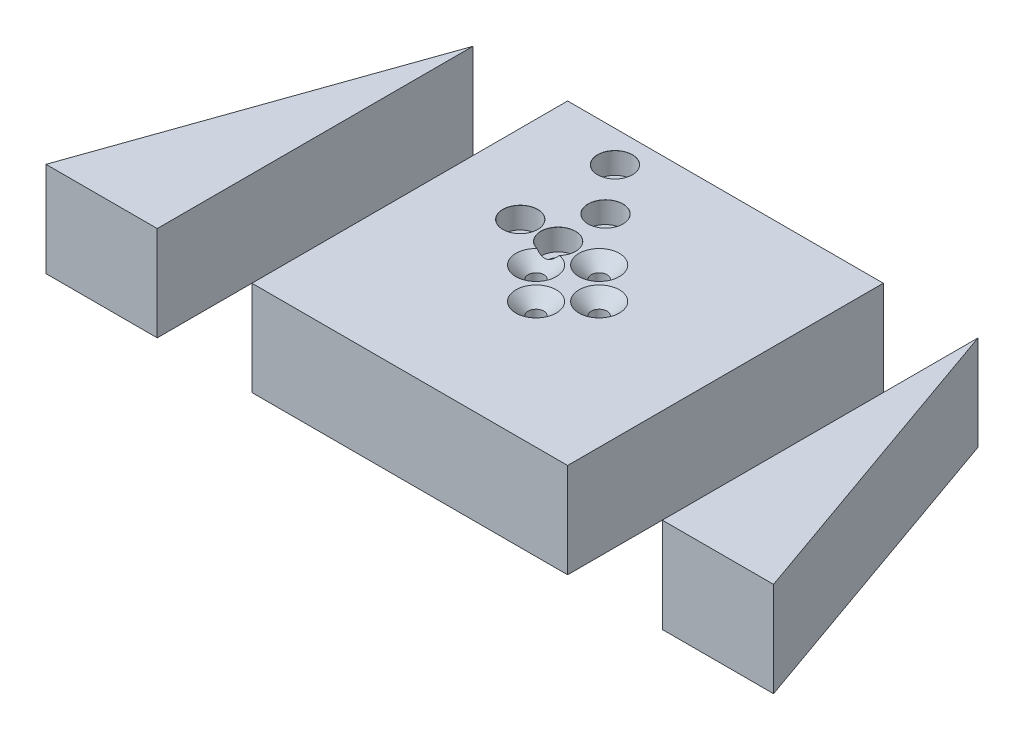
ISO-10303-21;
HEADER;
FILE_DESCRIPTION(('STEP AP214'),'2;1');
FILE_NAME('part.step','',(''),(''),'','','');
FILE_SCHEMA(('AUTOMOTIVE_DESIGN { 1 0 10303 214 1 1 1 1 }'));
ENDSEC;
DATA;
#1=APPLICATION_CONTEXT('core data for automotive mechanical design processes');
#2=APPLICATION_PROTOCOL_DEFINITION('international standard','automotive_design',2000,#1);
#3=PRODUCT_CONTEXT('',#1,'mechanical');
#4=PRODUCT('Part','Part','',(#3));
#5=PRODUCT_RELATED_PRODUCT_CATEGORY('part','',(#4));
#6=PRODUCT_DEFINITION_FORMATION('','',#4);
#7=PRODUCT_DEFINITION_CONTEXT('part definition',#1,'design');
#8=PRODUCT_DEFINITION('design','',#6,#7);
#9=PRODUCT_DEFINITION_SHAPE('','',#8);
#10=(LENGTH_UNIT() NAMED_UNIT(*) SI_UNIT(.MILLI.,.METRE.));
#11=(NAMED_UNIT(*) PLANE_ANGLE_UNIT() SI_UNIT($,.RADIAN.));
#12=(NAMED_UNIT(*) SI_UNIT($,.STERADIAN.) SOLID_ANGLE_UNIT());
#13=UNCERTAINTY_MEASURE_WITH_UNIT(LENGTH_MEASURE(1.E-05),#10,'distance_accuracy_value','');
#14=(GEOMETRIC_REPRESENTATION_CONTEXT(3) GLOBAL_UNCERTAINTY_ASSIGNED_CONTEXT((#13)) GLOBAL_UNIT_ASSIGNED_CONTEXT((#10,
#11,#12)) REPRESENTATION_CONTEXT('',''));
#15=CARTESIAN_POINT('',(0.,0.,0.));
#16=DIRECTION('',(0.,0.,1.));
#17=DIRECTION('',(1.,0.,0.));
#18=AXIS2_PLACEMENT_3D('',#15,#16,#17);
#19=CARTESIAN_POINT('',(-80.,30.,-50.));
#20=DIRECTION('',(-1.,0.,0.));
#21=DIRECTION('',(0.,0.,-1.));
#22=AXIS2_PLACEMENT_3D('',#19,#20,#21);
#23=PLANE('',#22);
#24=DIRECTION('',(0.,0.,1.));
#25=VECTOR('',#24,1.);
#26=CARTESIAN_POINT('',(-80.,0.,-50.));
#27=LINE('',#26,#25);
#28=CARTESIAN_POINT('',(-80.,0.,-50.));
#29=VERTEX_POINT('',#28);
#30=CARTESIAN_POINT('',(-80.,0.,50.));
#31=VERTEX_POINT('',#30);
#32=EDGE_CURVE('E12',#29,#31,#27,.T.);
#33=ORIENTED_EDGE('',*,*,#32,.F.);
#34=DIRECTION('',(0.,-1.,0.));
#35=VECTOR('',#34,1.);
#36=CARTESIAN_POINT('',(-80.,30.,-50.));
#37=LINE('',#36,#35);
#38=CARTESIAN_POINT('',(-80.,30.,-50.));
#39=VERTEX_POINT('',#38);
#40=EDGE_CURVE('E103',#39,#29,#37,.T.);
#41=ORIENTED_EDGE('',*,*,#40,.F.);
#42=DIRECTION('',(0.,0.,1.));
#43=VECTOR('',#42,1.);
#44=CARTESIAN_POINT('',(-80.,30.,-50.));
#45=LINE('',#44,#43);
#46=CARTESIAN_POINT('',(-80.,30.,50.));
#47=VERTEX_POINT('',#46);
#48=EDGE_CURVE('E65',#39,#47,#45,.T.);
#49=ORIENTED_EDGE('',*,*,#48,.T.);
#50=DIRECTION('',(0.,-1.,0.));
#51=VECTOR('',#50,1.);
#52=CARTESIAN_POINT('',(-80.,30.,50.));
#53=LINE('',#52,#51);
#54=EDGE_CURVE('E108',#47,#31,#53,.T.);
#55=ORIENTED_EDGE('',*,*,#54,.T.);
#56=EDGE_LOOP('',(#33,#41,#49,#55));
#57=FACE_BOUND('',#56,.T.);
#58=ADVANCED_FACE('F59',(#57),#23,.F.);
#59=CARTESIAN_POINT('',(-80.,30.,50.));
#60=DIRECTION('',(0.,0.,-1.));
#61=DIRECTION('',(1.,0.,0.));
#62=AXIS2_PLACEMENT_3D('',#59,#60,#61);
#63=PLANE('',#62);
#64=DIRECTION('',(-1.,0.,0.));
#65=VECTOR('',#64,1.);
#66=CARTESIAN_POINT('',(-80.,0.,50.));
#67=LINE('',#66,#65);
#68=CARTESIAN_POINT('',(-115.235457063712,0.,50.));
#69=VERTEX_POINT('',#68);
#70=EDGE_CURVE('E66',#31,#69,#67,.T.);
#71=ORIENTED_EDGE('',*,*,#70,.F.);
#72=ORIENTED_EDGE('',*,*,#54,.F.);
#73=DIRECTION('',(-1.,0.,0.));
#74=VECTOR('',#73,1.);
#75=CARTESIAN_POINT('',(-80.,30.,50.));
#76=LINE('',#75,#74);
#77=CARTESIAN_POINT('',(-115.235457063712,30.,50.));
#78=VERTEX_POINT('',#77);
#79=EDGE_CURVE('E91',#47,#78,#76,.T.);
#80=ORIENTED_EDGE('',*,*,#79,.T.);
#81=DIRECTION('',(0.,-1.,0.));
#82=VECTOR('',#81,1.);
#83=CARTESIAN_POINT('',(-115.235457063712,30.,50.));
#84=LINE('',#83,#82);
#85=EDGE_CURVE('E110',#78,#69,#84,.T.);
#86=ORIENTED_EDGE('',*,*,#85,.T.);
#87=EDGE_LOOP('',(#71,#72,#80,#86));
#88=FACE_BOUND('',#87,.T.);
#89=ADVANCED_FACE('F111',(#88),#63,.F.);
#90=CARTESIAN_POINT('',(-115.235457063712,30.,50.));
#91=DIRECTION('',(0.943163845465981,0.,0.33232809180962));
#92=DIRECTION('',(-0.33232809180962,0.,0.943163845465981));
#93=AXIS2_PLACEMENT_3D('',#90,#91,#92);
#94=PLANE('',#93);
#95=DIRECTION('',(0.33232809180962,0.,-0.943163845465981));
#96=VECTOR('',#95,1.);
#97=CARTESIAN_POINT('',(-115.235457063712,0.,50.));
#98=LINE('',#97,#96);
#99=EDGE_CURVE('E96',#69,#29,#98,.T.);
#100=ORIENTED_EDGE('',*,*,#99,.F.);
#101=ORIENTED_EDGE('',*,*,#85,.F.);
#102=DIRECTION('',(0.33232809180962,0.,-0.943163845465981));
#103=VECTOR('',#102,1.);
#104=CARTESIAN_POINT('',(-115.235457063712,30.,50.));
#105=LINE('',#104,#103);
#106=EDGE_CURVE('E89',#78,#39,#105,.T.);
#107=ORIENTED_EDGE('',*,*,#106,.T.);
#108=ORIENTED_EDGE('',*,*,#40,.T.);
#109=EDGE_LOOP('',(#100,#101,#107,#108));
#110=FACE_BOUND('',#109,.T.);
#111=ADVANCED_FACE('F102',(#110),#94,.F.);
#112=CARTESIAN_POINT('',(0.,30.,0.));
#113=DIRECTION('',(0.,1.,0.));
#114=DIRECTION('',(0.,0.,1.));
#115=AXIS2_PLACEMENT_3D('',#112,#113,#114);
#116=PLANE('',#115);
#117=ORIENTED_EDGE('',*,*,#48,.F.);
#118=ORIENTED_EDGE('',*,*,#106,.F.);
#119=ORIENTED_EDGE('',*,*,#79,.F.);
#120=EDGE_LOOP('',(#117,#118,#119));
#121=FACE_BOUND('',#120,.T.);
#122=ADVANCED_FACE('F58',(#121),#116,.T.);
#123=CARTESIAN_POINT('',(0.,0.,0.));
#124=DIRECTION('',(0.,1.,0.));
#125=DIRECTION('',(0.,0.,1.));
#126=AXIS2_PLACEMENT_3D('',#123,#124,#125);
#127=PLANE('',#126);
#128=ORIENTED_EDGE('',*,*,#32,.T.);
#129=ORIENTED_EDGE('',*,*,#70,.T.);
#130=ORIENTED_EDGE('',*,*,#99,.T.);
#131=EDGE_LOOP('',(#128,#129,#130));
#132=FACE_BOUND('',#131,.T.);
#133=ADVANCED_FACE('F98',(#132),#127,.F.);
#134=CLOSED_SHELL('',(#58,#89,#111,#122,#133));
#135=MANIFOLD_SOLID_BREP('B2',#134);
#136=CARTESIAN_POINT('',(80.,30.,-50.));
#137=DIRECTION('',(1.,0.,0.));
#138=DIRECTION('',(0.,0.,-1.));
#139=AXIS2_PLACEMENT_3D('',#136,#137,#138);
#140=PLANE('',#139);
#141=DIRECTION('',(0.,0.,1.));
#142=VECTOR('',#141,1.);
#143=CARTESIAN_POINT('',(80.,0.,-50.));
#144=LINE('',#143,#142);
#145=CARTESIAN_POINT('',(80.,0.,-50.));
#146=VERTEX_POINT('',#145);
#147=CARTESIAN_POINT('',(80.,0.,50.));
#148=VERTEX_POINT('',#147);
#149=EDGE_CURVE('E57',#146,#148,#144,.T.);
#150=ORIENTED_EDGE('',*,*,#149,.T.);
#151=DIRECTION('',(0.,-1.,0.));
#152=VECTOR('',#151,1.);
#153=CARTESIAN_POINT('',(80.,30.,50.));
#154=LINE('',#153,#152);
#155=CARTESIAN_POINT('',(80.,30.,50.));
#156=VERTEX_POINT('',#155);
#157=EDGE_CURVE('E254',#156,#148,#154,.T.);
#158=ORIENTED_EDGE('',*,*,#157,.F.);
#159=DIRECTION('',(0.,0.,1.));
#160=VECTOR('',#159,1.);
#161=CARTESIAN_POINT('',(80.,30.,-50.));
#162=LINE('',#161,#160);
#163=CARTESIAN_POINT('',(80.,30.,-50.));
#164=VERTEX_POINT('',#163);
#165=EDGE_CURVE('E166',#164,#156,#162,.T.);
#166=ORIENTED_EDGE('',*,*,#165,.F.);
#167=DIRECTION('',(0.,-1.,0.));
#168=VECTOR('',#167,1.);
#169=CARTESIAN_POINT('',(80.,30.,-50.));
#170=LINE('',#169,#168);
#171=EDGE_CURVE('E210',#164,#146,#170,.T.);
#172=ORIENTED_EDGE('',*,*,#171,.T.);
#173=EDGE_LOOP('',(#150,#158,#166,#172));
#174=FACE_BOUND('',#173,.T.);
#175=ADVANCED_FACE('F164',(#174),#140,.F.);
#176=CARTESIAN_POINT('',(80.,30.,50.));
#177=DIRECTION('',(0.,0.,-1.));
#178=DIRECTION('',(-1.,0.,0.));
#179=AXIS2_PLACEMENT_3D('',#176,#177,#178);
#180=PLANE('',#179);
#181=DIRECTION('',(1.,0.,0.));
#182=VECTOR('',#181,1.);
#183=CARTESIAN_POINT('',(80.,0.,50.));
#184=LINE('',#183,#182);
#185=CARTESIAN_POINT('',(115.235457063712,0.,50.));
#186=VERTEX_POINT('',#185);
#187=EDGE_CURVE('E172',#148,#186,#184,.T.);
#188=ORIENTED_EDGE('',*,*,#187,.T.);
#189=DIRECTION('',(0.,-1.,0.));
#190=VECTOR('',#189,1.);
#191=CARTESIAN_POINT('',(115.235457063712,30.,50.));
#192=LINE('',#191,#190);
#193=CARTESIAN_POINT('',(115.235457063712,30.,50.));
#194=VERTEX_POINT('',#193);
#195=EDGE_CURVE('E207',#194,#186,#192,.T.);
#196=ORIENTED_EDGE('',*,*,#195,.F.);
#197=DIRECTION('',(1.,0.,0.));
#198=VECTOR('',#197,1.);
#199=CARTESIAN_POINT('',(80.,30.,50.));
#200=LINE('',#199,#198);
#201=EDGE_CURVE('E198',#156,#194,#200,.T.);
#202=ORIENTED_EDGE('',*,*,#201,.F.);
#203=ORIENTED_EDGE('',*,*,#157,.T.);
#204=EDGE_LOOP('',(#188,#196,#202,#203));
#205=FACE_BOUND('',#204,.T.);
#206=ADVANCED_FACE('F225',(#205),#180,.F.);
#207=CARTESIAN_POINT('',(115.235457063712,30.,50.));
#208=DIRECTION('',(-0.943163845465981,0.,0.33232809180962));
#209=DIRECTION('',(0.33232809180962,0.,0.943163845465981));
#210=AXIS2_PLACEMENT_3D('',#207,#208,#209);
#211=PLANE('',#210);
#212=DIRECTION('',(-0.33232809180962,0.,-0.943163845465981));
#213=VECTOR('',#212,1.);
#214=CARTESIAN_POINT('',(115.235457063712,0.,50.));
#215=LINE('',#214,#213);
#216=EDGE_CURVE('E201',#186,#146,#215,.T.);
#217=ORIENTED_EDGE('',*,*,#216,.T.);
#218=ORIENTED_EDGE('',*,*,#171,.F.);
#219=DIRECTION('',(-0.33232809180962,0.,-0.943163845465981));
#220=VECTOR('',#219,1.);
#221=CARTESIAN_POINT('',(115.235457063712,30.,50.));
#222=LINE('',#221,#220);
#223=EDGE_CURVE('E213',#194,#164,#222,.T.);
#224=ORIENTED_EDGE('',*,*,#223,.F.);
#225=ORIENTED_EDGE('',*,*,#195,.T.);
#226=EDGE_LOOP('',(#217,#218,#224,#225));
#227=FACE_BOUND('',#226,.T.);
#228=ADVANCED_FACE('F202',(#227),#211,.F.);
#229=CARTESIAN_POINT('',(0.,30.,0.));
#230=DIRECTION('',(0.,1.,0.));
#231=DIRECTION('',(0.,0.,1.));
#232=AXIS2_PLACEMENT_3D('',#229,#230,#231);
#233=PLANE('',#232);
#234=ORIENTED_EDGE('',*,*,#165,.T.);
#235=ORIENTED_EDGE('',*,*,#201,.T.);
#236=ORIENTED_EDGE('',*,*,#223,.T.);
#237=EDGE_LOOP('',(#234,#235,#236));
#238=FACE_BOUND('',#237,.T.);
#239=ADVANCED_FACE('F170',(#238),#233,.T.);
#240=CARTESIAN_POINT('',(0.,0.,0.));
#241=DIRECTION('',(0.,1.,0.));
#242=DIRECTION('',(0.,0.,1.));
#243=AXIS2_PLACEMENT_3D('',#240,#241,#242);
#244=PLANE('',#243);
#245=ORIENTED_EDGE('',*,*,#149,.F.);
#246=ORIENTED_EDGE('',*,*,#216,.F.);
#247=ORIENTED_EDGE('',*,*,#187,.F.);
#248=EDGE_LOOP('',(#245,#246,#247));
#249=FACE_BOUND('',#248,.T.);
#250=ADVANCED_FACE('F214',(#249),#244,.F.);
#251=CLOSED_SHELL('',(#175,#206,#228,#239,#250));
#252=MANIFOLD_SOLID_BREP('B6',#251);
#253=CARTESIAN_POINT('',(50.,30.,-50.));
#254=DIRECTION('',(-1.,0.,0.));
#255=DIRECTION('',(0.,0.,1.));
#256=AXIS2_PLACEMENT_3D('',#253,#254,#255);
#257=PLANE('',#256);
#258=DIRECTION('',(0.,0.,-1.));
#259=VECTOR('',#258,1.);
#260=CARTESIAN_POINT('',(50.,0.,-50.));
#261=LINE('',#260,#259);
#262=CARTESIAN_POINT('',(50.,0.,50.));
#263=VERTEX_POINT('',#262);
#264=CARTESIAN_POINT('',(50.,0.,-50.));
#265=VERTEX_POINT('',#264);
#266=EDGE_CURVE('E425',#263,#265,#261,.T.);
#267=ORIENTED_EDGE('',*,*,#266,.T.);
#268=DIRECTION('',(0.,-1.,0.));
#269=VECTOR('',#268,1.);
#270=CARTESIAN_POINT('',(50.,30.,-50.));
#271=LINE('',#270,#269);
#272=CARTESIAN_POINT('',(50.,30.,-50.));
#273=VERTEX_POINT('',#272);
#274=EDGE_CURVE('E452',#273,#265,#271,.T.);
#275=ORIENTED_EDGE('',*,*,#274,.F.);
#276=DIRECTION('',(0.,0.,-1.));
#277=VECTOR('',#276,1.);
#278=CARTESIAN_POINT('',(50.,30.,-50.));
#279=LINE('',#278,#277);
#280=CARTESIAN_POINT('',(50.,30.,50.));
#281=VERTEX_POINT('',#280);
#282=EDGE_CURVE('E421',#281,#273,#279,.T.);
#283=ORIENTED_EDGE('',*,*,#282,.F.);
#284=DIRECTION('',(0.,-1.,0.));
#285=VECTOR('',#284,1.);
#286=CARTESIAN_POINT('',(50.,30.,50.));
#287=LINE('',#286,#285);
#288=EDGE_CURVE('E433',#281,#263,#287,.T.);
#289=ORIENTED_EDGE('',*,*,#288,.T.);
#290=EDGE_LOOP('',(#267,#275,#283,#289));
#291=FACE_BOUND('',#290,.T.);
#292=ADVANCED_FACE('F263',(#291),#257,.F.);
#293=CARTESIAN_POINT('',(-50.,30.,-50.));
#294=DIRECTION('',(0.,0.,1.));
#295=DIRECTION('',(1.,0.,0.));
#296=AXIS2_PLACEMENT_3D('',#293,#294,#295);
#297=PLANE('',#296);
#298=DIRECTION('',(-1.,0.,0.));
#299=VECTOR('',#298,1.);
#300=CARTESIAN_POINT('',(-50.,0.,-50.));
#301=LINE('',#300,#299);
#302=CARTESIAN_POINT('',(-50.,0.,-50.));
#303=VERTEX_POINT('',#302);
#304=EDGE_CURVE('E440',#265,#303,#301,.T.);
#305=ORIENTED_EDGE('',*,*,#304,.T.);
#306=DIRECTION('',(0.,-1.,0.));
#307=VECTOR('',#306,1.);
#308=CARTESIAN_POINT('',(-50.,30.,-50.));
#309=LINE('',#308,#307);
#310=CARTESIAN_POINT('',(-50.,30.,-50.));
#311=VERTEX_POINT('',#310);
#312=EDGE_CURVE('E447',#311,#303,#309,.T.);
#313=ORIENTED_EDGE('',*,*,#312,.F.);
#314=DIRECTION('',(-1.,0.,0.));
#315=VECTOR('',#314,1.);
#316=CARTESIAN_POINT('',(-50.,30.,-50.));
#317=LINE('',#316,#315);
#318=EDGE_CURVE('E325',#273,#311,#317,.T.);
#319=ORIENTED_EDGE('',*,*,#318,.F.);
#320=ORIENTED_EDGE('',*,*,#274,.T.);
#321=EDGE_LOOP('',(#305,#313,#319,#320));
#322=FACE_BOUND('',#321,.T.);
#323=ADVANCED_FACE('F554',(#322),#297,.F.);
#324=CARTESIAN_POINT('',(-50.,30.,-50.));
#325=DIRECTION('',(1.,0.,0.));
#326=DIRECTION('',(0.,0.,-1.));
#327=AXIS2_PLACEMENT_3D('',#324,#325,#326);
#328=PLANE('',#327);
#329=DIRECTION('',(0.,0.,1.));
#330=VECTOR('',#329,1.);
#331=CARTESIAN_POINT('',(-50.,0.,-50.));
#332=LINE('',#331,#330);
#333=CARTESIAN_POINT('',(-50.,0.,50.));
#334=VERTEX_POINT('',#333);
#335=EDGE_CURVE('E439',#303,#334,#332,.T.);
#336=ORIENTED_EDGE('',*,*,#335,.T.);
#337=DIRECTION('',(0.,-1.,0.));
#338=VECTOR('',#337,1.);
#339=CARTESIAN_POINT('',(-50.,30.,50.));
#340=LINE('',#339,#338);
#341=CARTESIAN_POINT('',(-50.,30.,50.));
#342=VERTEX_POINT('',#341);
#343=EDGE_CURVE('E450',#342,#334,#340,.T.);
#344=ORIENTED_EDGE('',*,*,#343,.F.);
#345=DIRECTION('',(0.,0.,1.));
#346=VECTOR('',#345,1.);
#347=CARTESIAN_POINT('',(-50.,30.,-50.));
#348=LINE('',#347,#346);
#349=EDGE_CURVE('E428',#311,#342,#348,.T.);
#350=ORIENTED_EDGE('',*,*,#349,.F.);
#351=ORIENTED_EDGE('',*,*,#312,.T.);
#352=EDGE_LOOP('',(#336,#344,#350,#351));
#353=FACE_BOUND('',#352,.T.);
#354=ADVANCED_FACE('F552',(#353),#328,.F.);
#355=CARTESIAN_POINT('',(-50.,30.,50.));
#356=DIRECTION('',(0.,0.,-1.));
#357=DIRECTION('',(-1.,0.,0.));
#358=AXIS2_PLACEMENT_3D('',#355,#356,#357);
#359=PLANE('',#358);
#360=DIRECTION('',(1.,0.,0.));
#361=VECTOR('',#360,1.);
#362=CARTESIAN_POINT('',(-50.,0.,50.));
#363=LINE('',#362,#361);
#364=EDGE_CURVE('E314',#334,#263,#363,.T.);
#365=ORIENTED_EDGE('',*,*,#364,.T.);
#366=ORIENTED_EDGE('',*,*,#288,.F.);
#367=DIRECTION('',(1.,0.,0.));
#368=VECTOR('',#367,1.);
#369=CARTESIAN_POINT('',(-50.,30.,50.));
#370=LINE('',#369,#368);
#371=EDGE_CURVE('E291',#342,#281,#370,.T.);
#372=ORIENTED_EDGE('',*,*,#371,.F.);
#373=ORIENTED_EDGE('',*,*,#343,.T.);
#374=EDGE_LOOP('',(#365,#366,#372,#373));
#375=FACE_BOUND('',#374,.T.);
#376=ADVANCED_FACE('F542',(#375),#359,.F.);
#377=CARTESIAN_POINT('',(0.,30.,0.));
#378=DIRECTION('',(0.,1.,0.));
#379=DIRECTION('',(0.,0.,1.));
#380=AXIS2_PLACEMENT_3D('',#377,#378,#379);
#381=PLANE('',#380);
#382=CARTESIAN_POINT('',(10.,30.,-1.04744440165294E-13));
#383=DIRECTION('',(0.,1.,0.));
#384=DIRECTION('',(0.,0.,1.));
#385=AXIS2_PLACEMENT_3D('',#382,#383,#384);
#386=CIRCLE('',#385,6.4);
#387=CARTESIAN_POINT('',(10.,30.,6.39999999999989));
#388=VERTEX_POINT('',#387);
#389=EDGE_CURVE('E782',#388,#388,#386,.T.);
#390=ORIENTED_EDGE('',*,*,#389,.F.);
#391=EDGE_LOOP('',(#390));
#392=FACE_BOUND('',#391,.T.);
#393=CARTESIAN_POINT('',(0.,30.,10.));
#394=DIRECTION('',(0.,1.,0.));
#395=DIRECTION('',(0.,0.,1.));
#396=AXIS2_PLACEMENT_3D('',#393,#394,#395);
#397=CIRCLE('',#396,6.4);
#398=CARTESIAN_POINT('',(0.,30.,16.4));
#399=VERTEX_POINT('',#398);
#400=EDGE_CURVE('E794',#399,#399,#397,.T.);
#401=ORIENTED_EDGE('',*,*,#400,.F.);
#402=EDGE_LOOP('',(#401));
#403=FACE_BOUND('',#402,.T.);
#404=CARTESIAN_POINT('',(-10.,30.,0.));
#405=DIRECTION('',(0.,1.,0.));
#406=DIRECTION('',(0.,0.,1.));
#407=AXIS2_PLACEMENT_3D('',#404,#405,#406);
#408=CIRCLE('',#407,6.4);
#409=CARTESIAN_POINT('',(-14.39358756039,30.,-4.65364248188297));
#410=VERTEX_POINT('',#409);
#411=CARTESIAN_POINT('',(-8.89359707263768,30.,-6.30363962820855));
#412=VERTEX_POINT('',#411);
#413=EDGE_CURVE('E284',#410,#412,#408,.T.);
#414=ORIENTED_EDGE('',*,*,#413,.F.);
#415=CARTESIAN_POINT('',(-13.,30.,-10.));
#416=DIRECTION('',(0.,1.,0.));
#417=DIRECTION('',(0.,0.,1.));
#418=AXIS2_PLACEMENT_3D('',#415,#416,#417);
#419=CIRCLE('',#418,5.525);
#420=EDGE_CURVE('E337',#412,#410,#419,.T.);
#421=ORIENTED_EDGE('',*,*,#420,.F.);
#422=EDGE_LOOP('',(#414,#421));
#423=FACE_BOUND('',#422,.T.);
#424=CARTESIAN_POINT('',(-13.,30.,-25.));
#425=DIRECTION('',(0.,1.,0.));
#426=DIRECTION('',(0.,0.,1.));
#427=AXIS2_PLACEMENT_3D('',#424,#425,#426);
#428=CIRCLE('',#427,5.525);
#429=CARTESIAN_POINT('',(-13.,30.,-19.475));
#430=VERTEX_POINT('',#429);
#431=EDGE_CURVE('E482',#430,#430,#428,.T.);
#432=ORIENTED_EDGE('',*,*,#431,.F.);
#433=EDGE_LOOP('',(#432));
#434=FACE_BOUND('',#433,.T.);
#435=CARTESIAN_POINT('',(-25.,30.,-40.));
#436=DIRECTION('',(0.,1.,0.));
#437=DIRECTION('',(0.,0.,1.));
#438=AXIS2_PLACEMENT_3D('',#435,#436,#437);
#439=CIRCLE('',#438,5.525);
#440=CARTESIAN_POINT('',(-25.,30.,-34.475));
#441=VERTEX_POINT('',#440);
#442=EDGE_CURVE('E367',#441,#441,#439,.T.);
#443=ORIENTED_EDGE('',*,*,#442,.F.);
#444=EDGE_LOOP('',(#443));
#445=FACE_BOUND('',#444,.T.);
#446=CARTESIAN_POINT('',(0.,30.,-10.));
#447=DIRECTION('',(0.,1.,0.));
#448=DIRECTION('',(0.,0.,1.));
#449=AXIS2_PLACEMENT_3D('',#446,#447,#448);
#450=CIRCLE('',#449,6.4);
#451=CARTESIAN_POINT('',(0.,30.,-3.6));
#452=VERTEX_POINT('',#451);
#453=EDGE_CURVE('E388',#452,#452,#450,.T.);
#454=ORIENTED_EDGE('',*,*,#453,.F.);
#455=EDGE_LOOP('',(#454));
#456=FACE_BOUND('',#455,.T.);
#457=CARTESIAN_POINT('',(-25.,30.,-10.));
#458=DIRECTION('',(0.,1.,0.));
#459=DIRECTION('',(0.,0.,1.));
#460=AXIS2_PLACEMENT_3D('',#457,#458,#459);
#461=CIRCLE('',#460,5.525);
#462=CARTESIAN_POINT('',(-25.,30.,-4.475));
#463=VERTEX_POINT('',#462);
#464=EDGE_CURVE('E405',#463,#463,#461,.T.);
#465=ORIENTED_EDGE('',*,*,#464,.F.);
#466=EDGE_LOOP('',(#465));
#467=FACE_BOUND('',#466,.T.);
#468=ORIENTED_EDGE('',*,*,#282,.T.);
#469=ORIENTED_EDGE('',*,*,#318,.T.);
#470=ORIENTED_EDGE('',*,*,#349,.T.);
#471=ORIENTED_EDGE('',*,*,#371,.T.);
#472=EDGE_LOOP('',(#468,#469,#470,#471));
#473=FACE_BOUND('',#472,.T.);
#474=ADVANCED_FACE('F336',(#392,#403,#423,#434,#445,#456,#467,#473),#381,.T.);
#475=CARTESIAN_POINT('',(0.,0.,0.));
#476=DIRECTION('',(0.,1.,0.));
#477=DIRECTION('',(0.,0.,1.));
#478=AXIS2_PLACEMENT_3D('',#475,#476,#477);
#479=PLANE('',#478);
#480=CARTESIAN_POINT('',(10.,0.,-1.04744440165294E-13));
#481=DIRECTION('',(0.,1.,0.));
#482=DIRECTION('',(0.,0.,1.));
#483=AXIS2_PLACEMENT_3D('',#480,#481,#482);
#484=CIRCLE('',#483,2.5);
#485=CARTESIAN_POINT('',(10.,0.,2.4999999999999));
#486=VERTEX_POINT('',#485);
#487=EDGE_CURVE('E786',#486,#486,#484,.T.);
#488=ORIENTED_EDGE('',*,*,#487,.T.);
#489=EDGE_LOOP('',(#488));
#490=FACE_BOUND('',#489,.T.);
#491=CARTESIAN_POINT('',(0.,0.,10.));
#492=DIRECTION('',(0.,1.,0.));
#493=DIRECTION('',(0.,0.,1.));
#494=AXIS2_PLACEMENT_3D('',#491,#492,#493);
#495=CIRCLE('',#494,2.5);
#496=CARTESIAN_POINT('',(0.,0.,12.5));
#497=VERTEX_POINT('',#496);
#498=EDGE_CURVE('E341',#497,#497,#495,.T.);
#499=ORIENTED_EDGE('',*,*,#498,.T.);
#500=EDGE_LOOP('',(#499));
#501=FACE_BOUND('',#500,.T.);
#502=CARTESIAN_POINT('',(-10.,0.,0.));
#503=DIRECTION('',(0.,1.,0.));
#504=DIRECTION('',(0.,0.,1.));
#505=AXIS2_PLACEMENT_3D('',#502,#503,#504);
#506=CIRCLE('',#505,2.5);
#507=CARTESIAN_POINT('',(-10.,0.,2.50000000000004));
#508=VERTEX_POINT('',#507);
#509=EDGE_CURVE('E484',#508,#508,#506,.T.);
#510=ORIENTED_EDGE('',*,*,#509,.T.);
#511=EDGE_LOOP('',(#510));
#512=FACE_BOUND('',#511,.T.);
#513=CARTESIAN_POINT('',(-13.,0.,-25.));
#514=DIRECTION('',(0.,1.,0.));
#515=DIRECTION('',(0.,0.,1.));
#516=AXIS2_PLACEMENT_3D('',#513,#514,#515);
#517=CIRCLE('',#516,3.29999999999999);
#518=CARTESIAN_POINT('',(-13.,0.,-21.7));
#519=VERTEX_POINT('',#518);
#520=EDGE_CURVE('E346',#519,#519,#517,.T.);
#521=ORIENTED_EDGE('',*,*,#520,.T.);
#522=EDGE_LOOP('',(#521));
#523=FACE_BOUND('',#522,.T.);
#524=CARTESIAN_POINT('',(-13.,0.,-10.));
#525=DIRECTION('',(0.,1.,0.));
#526=DIRECTION('',(0.,0.,1.));
#527=AXIS2_PLACEMENT_3D('',#524,#525,#526);
#528=CIRCLE('',#527,3.29999999999999);
#529=CARTESIAN_POINT('',(-13.,0.,-6.70000000000001));
#530=VERTEX_POINT('',#529);
#531=EDGE_CURVE('E368',#530,#530,#528,.T.);
#532=ORIENTED_EDGE('',*,*,#531,.T.);
#533=EDGE_LOOP('',(#532));
#534=FACE_BOUND('',#533,.T.);
#535=CARTESIAN_POINT('',(-25.,0.,-40.));
#536=DIRECTION('',(0.,1.,0.));
#537=DIRECTION('',(0.,0.,1.));
#538=AXIS2_PLACEMENT_3D('',#535,#536,#537);
#539=CIRCLE('',#538,3.29999999999999);
#540=CARTESIAN_POINT('',(-25.,0.,-36.7));
#541=VERTEX_POINT('',#540);
#542=EDGE_CURVE('E387',#541,#541,#539,.T.);
#543=ORIENTED_EDGE('',*,*,#542,.T.);
#544=EDGE_LOOP('',(#543));
#545=FACE_BOUND('',#544,.T.);
#546=CARTESIAN_POINT('',(0.,0.,-10.));
#547=DIRECTION('',(0.,1.,0.));
#548=DIRECTION('',(0.,0.,1.));
#549=AXIS2_PLACEMENT_3D('',#546,#547,#548);
#550=CIRCLE('',#549,2.5);
#551=CARTESIAN_POINT('',(0.,0.,-7.5));
#552=VERTEX_POINT('',#551);
#553=EDGE_CURVE('E396',#552,#552,#550,.T.);
#554=ORIENTED_EDGE('',*,*,#553,.T.);
#555=EDGE_LOOP('',(#554));
#556=FACE_BOUND('',#555,.T.);
#557=CARTESIAN_POINT('',(-25.,0.,-10.));
#558=DIRECTION('',(0.,1.,0.));
#559=DIRECTION('',(0.,0.,1.));
#560=AXIS2_PLACEMENT_3D('',#557,#558,#559);
#561=CIRCLE('',#560,3.29999999999999);
#562=CARTESIAN_POINT('',(-25.,0.,-6.70000000000001));
#563=VERTEX_POINT('',#562);
#564=EDGE_CURVE('E416',#563,#563,#561,.T.);
#565=ORIENTED_EDGE('',*,*,#564,.T.);
#566=EDGE_LOOP('',(#565));
#567=FACE_BOUND('',#566,.T.);
#568=ORIENTED_EDGE('',*,*,#266,.F.);
#569=ORIENTED_EDGE('',*,*,#364,.F.);
#570=ORIENTED_EDGE('',*,*,#335,.F.);
#571=ORIENTED_EDGE('',*,*,#304,.F.);
#572=EDGE_LOOP('',(#568,#569,#570,#571));
#573=FACE_BOUND('',#572,.T.);
#574=ADVANCED_FACE('F539',(#490,#501,#512,#523,#534,#545,#556,#567,#573),#479,.F.);
#575=CARTESIAN_POINT('',(-25.,30.,-10.));
#576=DIRECTION('',(0.,1.,0.));
#577=DIRECTION('',(0.,0.,1.));
#578=AXIS2_PLACEMENT_3D('',#575,#576,#577);
#579=CYLINDRICAL_SURFACE('',#578,3.3);
#580=ORIENTED_EDGE('',*,*,#564,.F.);
#581=EDGE_LOOP('',(#580));
#582=FACE_BOUND('',#581,.T.);
#583=CARTESIAN_POINT('',(-25.,23.2,-10.));
#584=DIRECTION('',(0.,1.,0.));
#585=DIRECTION('',(0.,0.,1.));
#586=AXIS2_PLACEMENT_3D('',#583,#584,#585);
#587=CIRCLE('',#586,3.30000000000001);
#588=CARTESIAN_POINT('',(-25.,23.2,-6.69999999999999));
#589=VERTEX_POINT('',#588);
#590=EDGE_CURVE('E412',#589,#589,#587,.T.);
#591=ORIENTED_EDGE('',*,*,#590,.T.);
#592=EDGE_LOOP('',(#591));
#593=FACE_BOUND('',#592,.T.);
#594=ADVANCED_FACE('F536',(#582,#593),#579,.F.);
#595=CARTESIAN_POINT('',(-19.5,23.2,-10.));
#596=DIRECTION('',(0.,-1.,0.));
#597=DIRECTION('',(0.,0.,-1.));
#598=AXIS2_PLACEMENT_3D('',#595,#596,#597);
#599=PLANE('',#598);
#600=ORIENTED_EDGE('',*,*,#590,.F.);
#601=EDGE_LOOP('',(#600));
#602=FACE_BOUND('',#601,.T.);
#603=CARTESIAN_POINT('',(-25.,23.2,-10.));
#604=DIRECTION('',(0.,1.,0.));
#605=DIRECTION('',(0.,0.,1.));
#606=AXIS2_PLACEMENT_3D('',#603,#604,#605);
#607=CIRCLE('',#606,5.49999999999999);
#608=CARTESIAN_POINT('',(-25.,23.2,-4.50000000000001));
#609=VERTEX_POINT('',#608);
#610=EDGE_CURVE('E407',#609,#609,#607,.T.);
#611=ORIENTED_EDGE('',*,*,#610,.T.);
#612=EDGE_LOOP('',(#611));
#613=FACE_BOUND('',#612,.T.);
#614=ADVANCED_FACE('F535',(#602,#613),#599,.F.);
#615=CARTESIAN_POINT('',(-25.,30.,-10.));
#616=DIRECTION('',(0.,1.,0.));
#617=DIRECTION('',(0.,0.,1.));
#618=AXIS2_PLACEMENT_3D('',#615,#616,#617);
#619=CYLINDRICAL_SURFACE('',#618,5.49999999999999);
#620=ORIENTED_EDGE('',*,*,#610,.F.);
#621=EDGE_LOOP('',(#620));
#622=FACE_BOUND('',#621,.T.);
#623=CARTESIAN_POINT('',(-25.,29.975,-10.));
#624=DIRECTION('',(0.,1.,0.));
#625=DIRECTION('',(0.,0.,1.));
#626=AXIS2_PLACEMENT_3D('',#623,#624,#625);
#627=CIRCLE('',#626,5.49999999999999);
#628=CARTESIAN_POINT('',(-25.,29.975,-4.50000000000001));
#629=VERTEX_POINT('',#628);
#630=EDGE_CURVE('E408',#629,#629,#627,.T.);
#631=ORIENTED_EDGE('',*,*,#630,.T.);
#632=EDGE_LOOP('',(#631));
#633=FACE_BOUND('',#632,.T.);
#634=ADVANCED_FACE('F526',(#622,#633),#619,.F.);
#635=CARTESIAN_POINT('',(-25.,30.,-10.));
#636=DIRECTION('',(0.,1.,0.));
#637=DIRECTION('',(0.,0.,1.));
#638=AXIS2_PLACEMENT_3D('',#635,#636,#637);
#639=CONICAL_SURFACE('',#638,5.525,0.785398163397379);
#640=ORIENTED_EDGE('',*,*,#630,.F.);
#641=EDGE_LOOP('',(#640));
#642=FACE_BOUND('',#641,.T.);
#643=ORIENTED_EDGE('',*,*,#464,.T.);
#644=EDGE_LOOP('',(#643));
#645=FACE_BOUND('',#644,.T.);
#646=ADVANCED_FACE('F522',(#642,#645),#639,.F.);
#647=CARTESIAN_POINT('',(0.,30.,-10.));
#648=DIRECTION('',(0.,1.,0.));
#649=DIRECTION('',(0.,0.,1.));
#650=AXIS2_PLACEMENT_3D('',#647,#648,#649);
#651=CYLINDRICAL_SURFACE('',#650,2.5);
#652=ORIENTED_EDGE('',*,*,#553,.F.);
#653=EDGE_LOOP('',(#652));
#654=FACE_BOUND('',#653,.T.);
#655=CARTESIAN_POINT('',(0.,26.1,-10.));
#656=DIRECTION('',(0.,1.,0.));
#657=DIRECTION('',(0.,0.,1.));
#658=AXIS2_PLACEMENT_3D('',#655,#656,#657);
#659=CIRCLE('',#658,2.5);
#660=CARTESIAN_POINT('',(0.,26.1,-7.5));
#661=VERTEX_POINT('',#660);
#662=EDGE_CURVE('E394',#661,#661,#659,.T.);
#663=ORIENTED_EDGE('',*,*,#662,.T.);
#664=EDGE_LOOP('',(#663));
#665=FACE_BOUND('',#664,.T.);
#666=ADVANCED_FACE('F517',(#654,#665),#651,.F.);
#667=CARTESIAN_POINT('',(0.,30.,-10.));
#668=DIRECTION('',(0.,1.,0.));
#669=DIRECTION('',(0.,0.,1.));
#670=AXIS2_PLACEMENT_3D('',#667,#668,#669);
#671=CONICAL_SURFACE('',#670,6.4,0.785398163397448);
#672=ORIENTED_EDGE('',*,*,#662,.F.);
#673=EDGE_LOOP('',(#672));
#674=FACE_BOUND('',#673,.T.);
#675=ORIENTED_EDGE('',*,*,#453,.T.);
#676=EDGE_LOOP('',(#675));
#677=FACE_BOUND('',#676,.T.);
#678=ADVANCED_FACE('F518',(#674,#677),#671,.F.);
#679=CARTESIAN_POINT('',(-25.,30.,-40.));
#680=DIRECTION('',(0.,1.,0.));
#681=DIRECTION('',(0.,0.,1.));
#682=AXIS2_PLACEMENT_3D('',#679,#680,#681);
#683=CYLINDRICAL_SURFACE('',#682,3.3);
#684=ORIENTED_EDGE('',*,*,#542,.F.);
#685=EDGE_LOOP('',(#684));
#686=FACE_BOUND('',#685,.T.);
#687=CARTESIAN_POINT('',(-25.,23.2,-40.));
#688=DIRECTION('',(0.,1.,0.));
#689=DIRECTION('',(0.,0.,1.));
#690=AXIS2_PLACEMENT_3D('',#687,#688,#689);
#691=CIRCLE('',#690,3.30000000000001);
#692=CARTESIAN_POINT('',(-25.,23.2,-36.7));
#693=VERTEX_POINT('',#692);
#694=EDGE_CURVE('E385',#693,#693,#691,.T.);
#695=ORIENTED_EDGE('',*,*,#694,.T.);
#696=EDGE_LOOP('',(#695));
#697=FACE_BOUND('',#696,.T.);
#698=ADVANCED_FACE('F515',(#686,#697),#683,.F.);
#699=CARTESIAN_POINT('',(-19.5,23.2,-40.));
#700=DIRECTION('',(0.,-1.,0.));
#701=DIRECTION('',(0.,0.,-1.));
#702=AXIS2_PLACEMENT_3D('',#699,#700,#701);
#703=PLANE('',#702);
#704=ORIENTED_EDGE('',*,*,#694,.F.);
#705=EDGE_LOOP('',(#704));
#706=FACE_BOUND('',#705,.T.);
#707=CARTESIAN_POINT('',(-25.,23.2,-40.));
#708=DIRECTION('',(0.,1.,0.));
#709=DIRECTION('',(0.,0.,1.));
#710=AXIS2_PLACEMENT_3D('',#707,#708,#709);
#711=CIRCLE('',#710,5.49999999999999);
#712=CARTESIAN_POINT('',(-25.,23.2,-34.5));
#713=VERTEX_POINT('',#712);
#714=EDGE_CURVE('E378',#713,#713,#711,.T.);
#715=ORIENTED_EDGE('',*,*,#714,.T.);
#716=EDGE_LOOP('',(#715));
#717=FACE_BOUND('',#716,.T.);
#718=ADVANCED_FACE('F506',(#706,#717),#703,.F.);
#719=CARTESIAN_POINT('',(-25.,30.,-40.));
#720=DIRECTION('',(0.,1.,0.));
#721=DIRECTION('',(0.,0.,1.));
#722=AXIS2_PLACEMENT_3D('',#719,#720,#721);
#723=CYLINDRICAL_SURFACE('',#722,5.49999999999999);
#724=ORIENTED_EDGE('',*,*,#714,.F.);
#725=EDGE_LOOP('',(#724));
#726=FACE_BOUND('',#725,.T.);
#727=CARTESIAN_POINT('',(-25.,29.975,-40.));
#728=DIRECTION('',(0.,1.,0.));
#729=DIRECTION('',(0.,0.,1.));
#730=AXIS2_PLACEMENT_3D('',#727,#728,#729);
#731=CIRCLE('',#730,5.49999999999999);
#732=CARTESIAN_POINT('',(-25.,29.975,-34.5));
#733=VERTEX_POINT('',#732);
#734=EDGE_CURVE('E372',#733,#733,#731,.T.);
#735=ORIENTED_EDGE('',*,*,#734,.T.);
#736=EDGE_LOOP('',(#735));
#737=FACE_BOUND('',#736,.T.);
#738=ADVANCED_FACE('F504',(#726,#737),#723,.F.);
#739=CARTESIAN_POINT('',(-25.,30.,-40.));
#740=DIRECTION('',(0.,1.,0.));
#741=DIRECTION('',(0.,0.,1.));
#742=AXIS2_PLACEMENT_3D('',#739,#740,#741);
#743=CONICAL_SURFACE('',#742,5.525,0.785398163397379);
#744=ORIENTED_EDGE('',*,*,#734,.F.);
#745=EDGE_LOOP('',(#744));
#746=FACE_BOUND('',#745,.T.);
#747=ORIENTED_EDGE('',*,*,#442,.T.);
#748=EDGE_LOOP('',(#747));
#749=FACE_BOUND('',#748,.T.);
#750=ADVANCED_FACE('F498',(#746,#749),#743,.F.);
#751=CARTESIAN_POINT('',(-13.,30.,-10.));
#752=DIRECTION('',(0.,1.,0.));
#753=DIRECTION('',(0.,0.,1.));
#754=AXIS2_PLACEMENT_3D('',#751,#752,#753);
#755=CYLINDRICAL_SURFACE('',#754,3.3);
#756=ORIENTED_EDGE('',*,*,#531,.F.);
#757=EDGE_LOOP('',(#756));
#758=FACE_BOUND('',#757,.T.);
#759=CARTESIAN_POINT('',(-13.,23.2,-10.));
#760=DIRECTION('',(0.,1.,0.));
#761=DIRECTION('',(0.,0.,1.));
#762=AXIS2_PLACEMENT_3D('',#759,#760,#761);
#763=CIRCLE('',#762,3.30000000000001);
#764=CARTESIAN_POINT('',(-13.,23.2,-6.69999999999999));
#765=VERTEX_POINT('',#764);
#766=EDGE_CURVE('E362',#765,#765,#763,.T.);
#767=ORIENTED_EDGE('',*,*,#766,.T.);
#768=EDGE_LOOP('',(#767));
#769=FACE_BOUND('',#768,.T.);
#770=ADVANCED_FACE('F497',(#758,#769),#755,.F.);
#771=CARTESIAN_POINT('',(-7.5,23.2,-10.));
#772=DIRECTION('',(0.,-1.,0.));
#773=DIRECTION('',(0.,0.,-1.));
#774=AXIS2_PLACEMENT_3D('',#771,#772,#773);
#775=PLANE('',#774);
#776=ORIENTED_EDGE('',*,*,#766,.F.);
#777=EDGE_LOOP('',(#776));
#778=FACE_BOUND('',#777,.T.);
#779=CARTESIAN_POINT('',(-13.,23.2,-10.));
#780=DIRECTION('',(0.,1.,0.));
#781=DIRECTION('',(0.,0.,1.));
#782=AXIS2_PLACEMENT_3D('',#779,#780,#781);
#783=CIRCLE('',#782,5.49999999999999);
#784=CARTESIAN_POINT('',(-13.,23.2,-4.50000000000001));
#785=VERTEX_POINT('',#784);
#786=EDGE_CURVE('E355',#785,#785,#783,.T.);
#787=ORIENTED_EDGE('',*,*,#786,.T.);
#788=EDGE_LOOP('',(#787));
#789=FACE_BOUND('',#788,.T.);
#790=ADVANCED_FACE('F495',(#778,#789),#775,.F.);
#791=CARTESIAN_POINT('',(-13.,30.,-10.));
#792=DIRECTION('',(0.,1.,0.));
#793=DIRECTION('',(0.,0.,1.));
#794=AXIS2_PLACEMENT_3D('',#791,#792,#793);
#795=CYLINDRICAL_SURFACE('',#794,5.49999999999999);
#796=ORIENTED_EDGE('',*,*,#786,.F.);
#797=EDGE_LOOP('',(#796));
#798=FACE_BOUND('',#797,.T.);
#799=CARTESIAN_POINT('',(-13.,29.975,-10.));
#800=DIRECTION('',(0.,1.,0.));
#801=DIRECTION('',(0.,0.,1.));
#802=AXIS2_PLACEMENT_3D('',#799,#800,#801);
#803=CIRCLE('',#802,5.49999999999999);
#804=CARTESIAN_POINT('',(-8.94272078704066,29.9749999999998,-6.28671501388777));
#805=VERTEX_POINT('',#804);
#806=CARTESIAN_POINT('',(-14.3432597175468,29.975,-4.66655333473596));
#807=VERTEX_POINT('',#806);
#808=EDGE_CURVE('E350',#805,#807,#803,.T.);
#809=ORIENTED_EDGE('',*,*,#808,.T.);
#810=CARTESIAN_POINT('',(-14.3434907501255,29.9752000000005,-4.66661152696269));
#811=CARTESIAN_POINT('',(-14.2857603413353,29.925227339412,-4.65207116447117));
#812=CARTESIAN_POINT('',(-14.2274330924719,29.8757040067011,-4.63837299784888));
#813=CARTESIAN_POINT('',(-14.1095009282667,29.7777058199444,-4.61273220373607));
#814=CARTESIAN_POINT('',(-14.0498956945903,29.7292312333174,-4.60079001960551));
#815=CARTESIAN_POINT('',(-13.8684757011314,29.5851622292952,-4.56760386901915));
#816=CARTESIAN_POINT('',(-13.7446351742447,29.4914279393279,-4.54914797528305));
#817=CARTESIAN_POINT('',(-13.4878159970439,29.3085643964263,-4.52011209813901));
#818=CARTESIAN_POINT('',(-13.3546847106682,29.2196139935491,-4.50974539359108));
#819=CARTESIAN_POINT('',(-13.0818298196653,29.05218604312,-4.49891914523435));
#820=CARTESIAN_POINT('',(-12.9421221901018,28.9736847271016,-4.49843672140458));
#821=CARTESIAN_POINT('',(-12.7310576597712,28.8688430278199,-4.5061602838647));
#822=CARTESIAN_POINT('',(-12.6623717682196,28.8367737203582,-4.50993279196524));
#823=CARTESIAN_POINT('',(-12.5235168521774,28.7765527339818,-4.52023481806161));
#824=CARTESIAN_POINT('',(-12.4533477642213,28.7484012231009,-4.52676445426194));
#825=CARTESIAN_POINT('',(-12.2415857593328,28.6711221678055,-4.55070515892495));
#826=CARTESIAN_POINT('',(-12.097824004624,28.6287001008418,-4.57249613096241));
#827=CARTESIAN_POINT('',(-11.879396921201,28.582321239023,-4.61484527405334));
#828=CARTESIAN_POINT('',(-11.8055760113753,28.5697102228469,-4.63072392016938));
#829=CARTESIAN_POINT('',(-11.6578946281383,28.5509540694202,-4.66572438805085));
#830=CARTESIAN_POINT('',(-11.5840341969278,28.544805481714,-4.68484447278965));
#831=CARTESIAN_POINT('',(-11.4368998276365,28.5392485042115,-4.72623839997968));
#832=CARTESIAN_POINT('',(-11.3636262371623,28.5398438505775,-4.74851398383983));
#833=CARTESIAN_POINT('',(-11.2184175013251,28.5477414779841,-4.79598148534776));
#834=CARTESIAN_POINT('',(-11.1464823186112,28.5550435715729,-4.82117332146989));
#835=CARTESIAN_POINT('',(-10.950338310111,28.5841065052409,-4.89444594454678));
#836=CARTESIAN_POINT('',(-10.8281314933201,28.6126487985176,-4.94532283198756));
#837=CARTESIAN_POINT('',(-10.5919598265664,28.6864712341595,-5.05345540996191));
#838=CARTESIAN_POINT('',(-10.4780034466269,28.7317682938473,-5.11071750669278));
#839=CARTESIAN_POINT('',(-10.274071059577,28.8281052490441,-5.22183337541013));
#840=CARTESIAN_POINT('',(-10.182954977308,28.8774923661531,-5.27506860673488));
#841=CARTESIAN_POINT('',(-10.0070314764565,28.9837646828864,-5.38449550382937));
#842=CARTESIAN_POINT('',(-9.92222888718255,29.0406555319115,-5.4406893777542));
#843=CARTESIAN_POINT('',(-9.7583234748413,29.1603963331892,-5.5557234659752));
#844=CARTESIAN_POINT('',(-9.67924101503039,29.223265892049,-5.6145720295742));
#845=CARTESIAN_POINT('',(-9.52665414549963,29.3534629655281,-5.73440840988214));
#846=CARTESIAN_POINT('',(-9.453147896497,29.4207889963628,-5.79539551141512));
#847=CARTESIAN_POINT('',(-9.30254450497607,29.5673742991981,-5.92691493184449));
#848=CARTESIAN_POINT('',(-9.22611156381605,29.6470847550489,-5.99770096548365));
#849=CARTESIAN_POINT('',(-9.07977689580836,29.809224015495,-6.14096013510093));
#850=CARTESIAN_POINT('',(-9.009827593201,29.8916258077721,-6.21341512809932));
#851=CARTESIAN_POINT('',(-8.94255993904947,29.9752,-6.28689077028514));
#852=B_SPLINE_CURVE_WITH_KNOTS('',3,(#810,#811,#812,#813,#814,#815,#816,#817,#818,#819,#820,
#821,#822,#823,#824,#825,#826,#827,#828,#829,#830,#831,#832,#833,#834,#835,#836,#837,#838,#839,
#840,#841,#842,#843,#844,#845,#846,#847,#848,#849,#850,#851),.UNSPECIFIED.,.F.,.F.,(4,2,2,2,2,2,
2,2,2,2,2,2,2,2,2,2,2,2,2,2,4),(0.,0.233163823042133,0.466386415831007,0.935174068212836,
1.41593931408702,1.89559156396921,2.12313143873924,2.35068106966289,2.80272015374487,
3.03210445267586,3.26136621515402,3.49075499563129,3.72013736495032,4.12457184755336,
4.52941580820833,4.87844391172159,5.22773630725856,5.57821650470321,5.92858059092281,
6.32188936254371,6.7120355203706),.UNSPECIFIED.);
#853=EDGE_CURVE('E332',#807,#805,#852,.T.);
#854=ORIENTED_EDGE('',*,*,#853,.T.);
#855=EDGE_LOOP('',(#809,#854));
#856=FACE_BOUND('',#855,.T.);
#857=ADVANCED_FACE('F488',(#798,#856),#795,.F.);
#858=CARTESIAN_POINT('',(-13.,30.,-10.));
#859=DIRECTION('',(0.,1.,0.));
#860=DIRECTION('',(0.,0.,1.));
#861=AXIS2_PLACEMENT_3D('',#858,#859,#860);
#862=CONICAL_SURFACE('',#861,5.525,0.785398163397379);
#863=ORIENTED_EDGE('',*,*,#420,.T.);
#864=CARTESIAN_POINT('',(-14.3939873929666,30.0002,-4.65354003211001));
#865=CARTESIAN_POINT('',(-14.3854759870507,29.9959421796568,-4.6557208946085));
#866=CARTESIAN_POINT('',(-14.376959189066,29.9916966028275,-4.65790444603325));
#867=CARTESIAN_POINT('',(-14.3599148088861,29.9832299361606,-4.66227692675385));
#868=CARTESIAN_POINT('',(-14.351387226691,29.9790088463233,-4.66446585604975));
#869=CARTESIAN_POINT('',(-14.3428542524268,29.9748,-4.66665747427194));
#870=B_SPLINE_CURVE_WITH_KNOTS('',3,(#864,#865,#866,#867,#868,#869),.UNSPECIFIED.,.F.,.F.,(4,2,
4),(0.,0.0292909202000364,0.058581840649075),.UNSPECIFIED.);
#871=EDGE_CURVE('E162',#410,#807,#870,.T.);
#872=ORIENTED_EDGE('',*,*,#871,.T.);
#873=ORIENTED_EDGE('',*,*,#808,.F.);
#874=CARTESIAN_POINT('',(-8.94311661913285,29.9748,-6.28657876426012));
#875=CARTESIAN_POINT('',(-8.93478636453311,29.9790088463232,-6.2894461146971));
#876=CARTESIAN_POINT('',(-8.92646209171189,29.9832299361606,-6.29231274190612));
#877=CARTESIAN_POINT('',(-8.90982550969719,29.9916966028274,-6.29804454984388));
#878=CARTESIAN_POINT('',(-8.90151320050362,29.9959421796568,-6.30090973057263));
#879=CARTESIAN_POINT('',(-8.89320687308846,30.0002,-6.30377418807344));
#880=B_SPLINE_CURVE_WITH_KNOTS('',3,(#874,#875,#876,#877,#878,#879),.UNSPECIFIED.,.F.,.F.,(4,2,
4),(0.,0.0292909204490478,0.0585818406490963),.UNSPECIFIED.);
#881=EDGE_CURVE('E280',#805,#412,#880,.T.);
#882=ORIENTED_EDGE('',*,*,#881,.T.);
#883=EDGE_LOOP('',(#863,#872,#873,#882));
#884=FACE_BOUND('',#883,.T.);
#885=ADVANCED_FACE('F344',(#884),#862,.F.);
#886=CARTESIAN_POINT('',(-13.,30.,-25.));
#887=DIRECTION('',(0.,1.,0.));
#888=DIRECTION('',(0.,0.,1.));
#889=AXIS2_PLACEMENT_3D('',#886,#887,#888);
#890=CYLINDRICAL_SURFACE('',#889,3.3);
#891=ORIENTED_EDGE('',*,*,#520,.F.);
#892=EDGE_LOOP('',(#891));
#893=FACE_BOUND('',#892,.T.);
#894=CARTESIAN_POINT('',(-13.,23.2,-25.));
#895=DIRECTION('',(0.,1.,0.));
#896=DIRECTION('',(0.,0.,1.));
#897=AXIS2_PLACEMENT_3D('',#894,#895,#896);
#898=CIRCLE('',#897,3.30000000000001);
#899=CARTESIAN_POINT('',(-13.,23.2,-21.7));
#900=VERTEX_POINT('',#899);
#901=EDGE_CURVE('E352',#900,#900,#898,.T.);
#902=ORIENTED_EDGE('',*,*,#901,.T.);
#903=EDGE_LOOP('',(#902));
#904=FACE_BOUND('',#903,.T.);
#905=ADVANCED_FACE('F686',(#893,#904),#890,.F.);
#906=CARTESIAN_POINT('',(-7.5,23.2,-25.));
#907=DIRECTION('',(0.,-1.,0.));
#908=DIRECTION('',(0.,0.,-1.));
#909=AXIS2_PLACEMENT_3D('',#906,#907,#908);
#910=PLANE('',#909);
#911=ORIENTED_EDGE('',*,*,#901,.F.);
#912=EDGE_LOOP('',(#911));
#913=FACE_BOUND('',#912,.T.);
#914=CARTESIAN_POINT('',(-13.,23.2,-25.));
#915=DIRECTION('',(0.,1.,0.));
#916=DIRECTION('',(0.,0.,1.));
#917=AXIS2_PLACEMENT_3D('',#914,#915,#916);
#918=CIRCLE('',#917,5.49999999999999);
#919=CARTESIAN_POINT('',(-13.,23.2,-19.5));
#920=VERTEX_POINT('',#919);
#921=EDGE_CURVE('E852',#920,#920,#918,.T.);
#922=ORIENTED_EDGE('',*,*,#921,.T.);
#923=EDGE_LOOP('',(#922));
#924=FACE_BOUND('',#923,.T.);
#925=ADVANCED_FACE('F694',(#913,#924),#910,.F.);
#926=CARTESIAN_POINT('',(-13.,30.,-25.));
#927=DIRECTION('',(0.,1.,0.));
#928=DIRECTION('',(0.,0.,1.));
#929=AXIS2_PLACEMENT_3D('',#926,#927,#928);
#930=CYLINDRICAL_SURFACE('',#929,5.49999999999999);
#931=ORIENTED_EDGE('',*,*,#921,.F.);
#932=EDGE_LOOP('',(#931));
#933=FACE_BOUND('',#932,.T.);
#934=CARTESIAN_POINT('',(-13.,29.975,-25.));
#935=DIRECTION('',(0.,1.,0.));
#936=DIRECTION('',(0.,0.,1.));
#937=AXIS2_PLACEMENT_3D('',#934,#935,#936);
#938=CIRCLE('',#937,5.49999999999999);
#939=CARTESIAN_POINT('',(-13.,29.975,-19.5));
#940=VERTEX_POINT('',#939);
#941=EDGE_CURVE('E857',#940,#940,#938,.T.);
#942=ORIENTED_EDGE('',*,*,#941,.T.);
#943=EDGE_LOOP('',(#942));
#944=FACE_BOUND('',#943,.T.);
#945=ADVANCED_FACE('F702',(#933,#944),#930,.F.);
#946=CARTESIAN_POINT('',(-13.,30.,-25.));
#947=DIRECTION('',(0.,1.,0.));
#948=DIRECTION('',(0.,0.,1.));
#949=AXIS2_PLACEMENT_3D('',#946,#947,#948);
#950=CONICAL_SURFACE('',#949,5.525,0.785398163397379);
#951=ORIENTED_EDGE('',*,*,#941,.F.);
#952=EDGE_LOOP('',(#951));
#953=FACE_BOUND('',#952,.T.);
#954=ORIENTED_EDGE('',*,*,#431,.T.);
#955=EDGE_LOOP('',(#954));
#956=FACE_BOUND('',#955,.T.);
#957=ADVANCED_FACE('F467',(#953,#956),#950,.F.);
#958=CARTESIAN_POINT('',(-10.,30.,0.));
#959=DIRECTION('',(0.,1.,0.));
#960=DIRECTION('',(0.,0.,1.));
#961=AXIS2_PLACEMENT_3D('',#958,#959,#960);
#962=CONICAL_SURFACE('',#961,6.4,0.785398163397448);
#963=CARTESIAN_POINT('',(-10.,26.1,0.));
#964=DIRECTION('',(0.,1.,0.));
#965=DIRECTION('',(0.,0.,1.));
#966=AXIS2_PLACEMENT_3D('',#963,#964,#965);
#967=CIRCLE('',#966,2.5);
#968=CARTESIAN_POINT('',(-10.,26.1,2.50000000000004));
#969=VERTEX_POINT('',#968);
#970=EDGE_CURVE('E345',#969,#969,#967,.T.);
#971=ORIENTED_EDGE('',*,*,#970,.F.);
#972=EDGE_LOOP('',(#971));
#973=FACE_BOUND('',#972,.T.);
#974=ORIENTED_EDGE('',*,*,#413,.T.);
#975=ORIENTED_EDGE('',*,*,#881,.F.);
#976=ORIENTED_EDGE('',*,*,#853,.F.);
#977=ORIENTED_EDGE('',*,*,#871,.F.);
#978=EDGE_LOOP('',(#974,#975,#976,#977));
#979=FACE_BOUND('',#978,.T.);
#980=ADVANCED_FACE('F328',(#973,#979),#962,.F.);
#981=CARTESIAN_POINT('',(-10.,30.,0.));
#982=DIRECTION('',(0.,1.,0.));
#983=DIRECTION('',(0.,0.,1.));
#984=AXIS2_PLACEMENT_3D('',#981,#982,#983);
#985=CYLINDRICAL_SURFACE('',#984,2.5);
#986=ORIENTED_EDGE('',*,*,#509,.F.);
#987=EDGE_LOOP('',(#986));
#988=FACE_BOUND('',#987,.T.);
#989=ORIENTED_EDGE('',*,*,#970,.T.);
#990=EDGE_LOOP('',(#989));
#991=FACE_BOUND('',#990,.T.);
#992=ADVANCED_FACE('F466',(#988,#991),#985,.F.);
#993=CARTESIAN_POINT('',(0.,30.,10.));
#994=DIRECTION('',(0.,1.,0.));
#995=DIRECTION('',(0.,0.,1.));
#996=AXIS2_PLACEMENT_3D('',#993,#994,#995);
#997=CYLINDRICAL_SURFACE('',#996,2.5);
#998=ORIENTED_EDGE('',*,*,#498,.F.);
#999=EDGE_LOOP('',(#998));
#1000=FACE_BOUND('',#999,.T.);
#1001=CARTESIAN_POINT('',(0.,26.1,10.));
#1002=DIRECTION('',(0.,1.,0.));
#1003=DIRECTION('',(0.,0.,1.));
#1004=AXIS2_PLACEMENT_3D('',#1001,#1002,#1003);
#1005=CIRCLE('',#1004,2.5);
#1006=CARTESIAN_POINT('',(0.,26.1,12.5));
#1007=VERTEX_POINT('',#1006);
#1008=EDGE_CURVE('E796',#1007,#1007,#1005,.T.);
#1009=ORIENTED_EDGE('',*,*,#1008,.T.);
#1010=EDGE_LOOP('',(#1009));
#1011=FACE_BOUND('',#1010,.T.);
#1012=ADVANCED_FACE('F473',(#1000,#1011),#997,.F.);
#1013=CARTESIAN_POINT('',(0.,30.,10.));
#1014=DIRECTION('',(0.,1.,0.));
#1015=DIRECTION('',(0.,0.,1.));
#1016=AXIS2_PLACEMENT_3D('',#1013,#1014,#1015);
#1017=CONICAL_SURFACE('',#1016,6.4,0.785398163397448);
#1018=ORIENTED_EDGE('',*,*,#1008,.F.);
#1019=EDGE_LOOP('',(#1018));
#1020=FACE_BOUND('',#1019,.T.);
#1021=ORIENTED_EDGE('',*,*,#400,.T.);
#1022=EDGE_LOOP('',(#1021));
#1023=FACE_BOUND('',#1022,.T.);
#1024=ADVANCED_FACE('F748',(#1020,#1023),#1017,.F.);
#1025=CARTESIAN_POINT('',(10.,30.,-1.04744440165294E-13));
#1026=DIRECTION('',(0.,1.,0.));
#1027=DIRECTION('',(0.,0.,1.));
#1028=AXIS2_PLACEMENT_3D('',#1025,#1026,#1027);
#1029=CYLINDRICAL_SURFACE('',#1028,2.5);
#1030=ORIENTED_EDGE('',*,*,#487,.F.);
#1031=EDGE_LOOP('',(#1030));
#1032=FACE_BOUND('',#1031,.T.);
#1033=CARTESIAN_POINT('',(10.,26.1,-1.04744440165294E-13));
#1034=DIRECTION('',(0.,1.,0.));
#1035=DIRECTION('',(0.,0.,1.));
#1036=AXIS2_PLACEMENT_3D('',#1033,#1034,#1035);
#1037=CIRCLE('',#1036,2.5);
#1038=CARTESIAN_POINT('',(10.,26.1,2.4999999999999));
#1039=VERTEX_POINT('',#1038);
#1040=EDGE_CURVE('E783',#1039,#1039,#1037,.T.);
#1041=ORIENTED_EDGE('',*,*,#1040,.T.);
#1042=EDGE_LOOP('',(#1041));
#1043=FACE_BOUND('',#1042,.T.);
#1044=ADVANCED_FACE('F752',(#1032,#1043),#1029,.F.);
#1045=CARTESIAN_POINT('',(10.,30.,-1.04744440165294E-13));
#1046=DIRECTION('',(0.,1.,0.));
#1047=DIRECTION('',(0.,0.,1.));
#1048=AXIS2_PLACEMENT_3D('',#1045,#1046,#1047);
#1049=CONICAL_SURFACE('',#1048,6.4,0.785398163397448);
#1050=ORIENTED_EDGE('',*,*,#1040,.F.);
#1051=EDGE_LOOP('',(#1050));
#1052=FACE_BOUND('',#1051,.T.);
#1053=ORIENTED_EDGE('',*,*,#389,.T.);
#1054=EDGE_LOOP('',(#1053));
#1055=FACE_BOUND('',#1054,.T.);
#1056=ADVANCED_FACE('F764',(#1052,#1055),#1049,.F.);
#1057=CLOSED_SHELL('',(#292,#323,#354,#376,#474,#574,#594,#614,#634,#646,#666,#678,#698,#718,
#738,#750,#770,#790,#857,#885,#905,#925,#945,#957,#980,#992,#1012,#1024,#1044,#1056));
#1058=MANIFOLD_SOLID_BREP('B49',#1057);
#1059=ADVANCED_BREP_SHAPE_REPRESENTATION('',(#18,#135,#252,#1058),#14);
#1060=SHAPE_DEFINITION_REPRESENTATION(#9,#1059);
ENDSEC;
END-ISO-10303-21;
